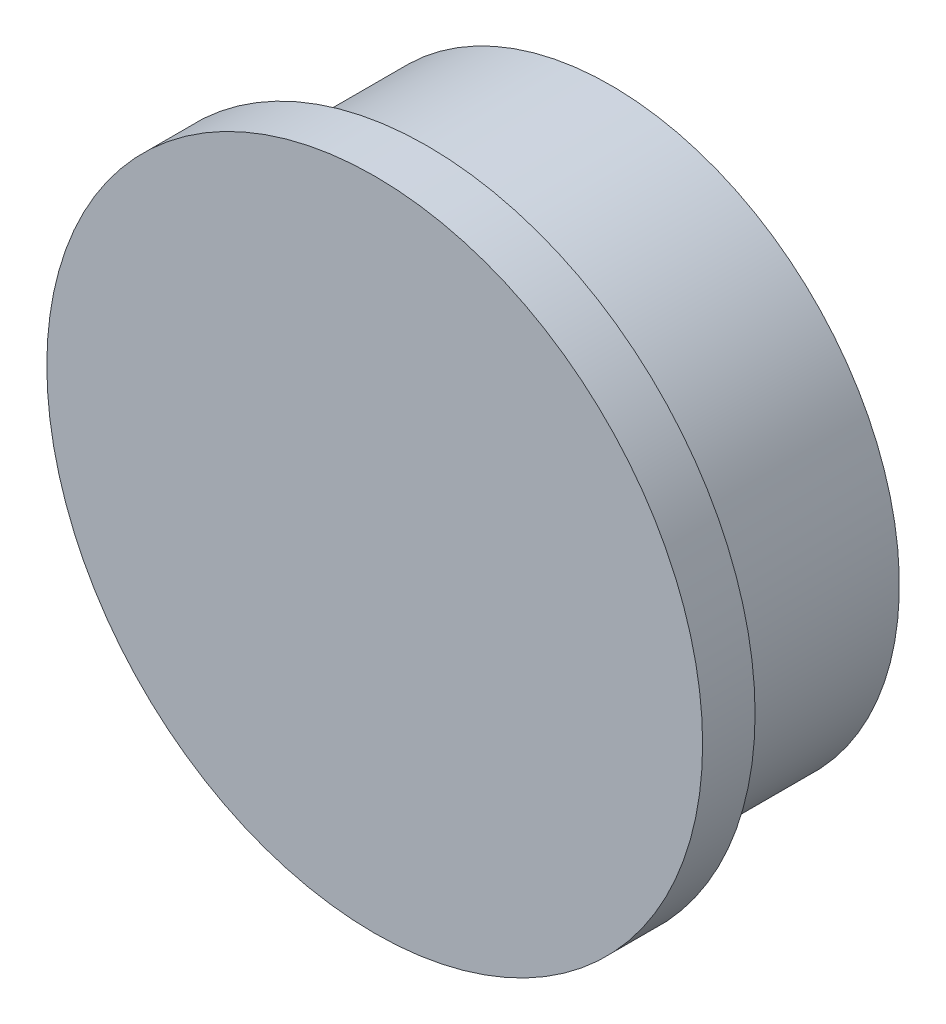
ISO-10303-21;
HEADER;
FILE_DESCRIPTION(('STEP AP214'),'2;1');
FILE_NAME('part.step','',(''),(''),'','','');
FILE_SCHEMA(('AUTOMOTIVE_DESIGN { 1 0 10303 214 1 1 1 1 }'));
ENDSEC;
DATA;
#1=APPLICATION_CONTEXT('core data for automotive mechanical design processes');
#2=APPLICATION_PROTOCOL_DEFINITION('international standard','automotive_design',2000,#1);
#3=PRODUCT_CONTEXT('',#1,'mechanical');
#4=PRODUCT('Part','Part','',(#3));
#5=PRODUCT_RELATED_PRODUCT_CATEGORY('part','',(#4));
#6=PRODUCT_DEFINITION_FORMATION('','',#4);
#7=PRODUCT_DEFINITION_CONTEXT('part definition',#1,'design');
#8=PRODUCT_DEFINITION('design','',#6,#7);
#9=PRODUCT_DEFINITION_SHAPE('','',#8);
#10=(LENGTH_UNIT() NAMED_UNIT(*) SI_UNIT(.MILLI.,.METRE.));
#11=(NAMED_UNIT(*) PLANE_ANGLE_UNIT() SI_UNIT($,.RADIAN.));
#12=(NAMED_UNIT(*) SI_UNIT($,.STERADIAN.) SOLID_ANGLE_UNIT());
#13=UNCERTAINTY_MEASURE_WITH_UNIT(LENGTH_MEASURE(1.E-05),#10,'distance_accuracy_value','');
#14=(GEOMETRIC_REPRESENTATION_CONTEXT(3) GLOBAL_UNCERTAINTY_ASSIGNED_CONTEXT((#13)) GLOBAL_UNIT_ASSIGNED_CONTEXT((#10,
#11,#12)) REPRESENTATION_CONTEXT('',''));
#15=CARTESIAN_POINT('',(0.,0.,0.));
#16=DIRECTION('',(0.,0.,1.));
#17=DIRECTION('',(1.,0.,0.));
#18=AXIS2_PLACEMENT_3D('',#15,#16,#17);
#19=CARTESIAN_POINT('',(0.,0.,2.));
#20=DIRECTION('',(0.,0.,-1.));
#21=DIRECTION('',(-1.,0.,0.));
#22=AXIS2_PLACEMENT_3D('',#19,#20,#21);
#23=CYLINDRICAL_SURFACE('',#22,12.5);
#24=CARTESIAN_POINT('',(0.,0.,2.));
#25=DIRECTION('',(0.,0.,1.));
#26=DIRECTION('',(1.,0.,0.));
#27=AXIS2_PLACEMENT_3D('',#24,#25,#26);
#28=CIRCLE('',#27,12.5);
#29=CARTESIAN_POINT('',(12.5,0.,2.));
#30=VERTEX_POINT('',#29);
#31=EDGE_CURVE('E48',#30,#30,#28,.T.);
#32=ORIENTED_EDGE('',*,*,#31,.F.);
#33=EDGE_LOOP('',(#32));
#34=FACE_BOUND('',#33,.T.);
#35=CARTESIAN_POINT('',(0.,0.,0.));
#36=DIRECTION('',(0.,0.,1.));
#37=DIRECTION('',(1.,0.,0.));
#38=AXIS2_PLACEMENT_3D('',#35,#36,#37);
#39=CIRCLE('',#38,12.5);
#40=CARTESIAN_POINT('',(12.5,0.,0.));
#41=VERTEX_POINT('',#40);
#42=EDGE_CURVE('E44',#41,#41,#39,.T.);
#43=ORIENTED_EDGE('',*,*,#42,.T.);
#44=EDGE_LOOP('',(#43));
#45=FACE_BOUND('',#44,.T.);
#46=ADVANCED_FACE('F41',(#34,#45),#23,.T.);
#47=CARTESIAN_POINT('',(0.,0.,2.));
#48=DIRECTION('',(0.,0.,1.));
#49=DIRECTION('',(1.,0.,0.));
#50=AXIS2_PLACEMENT_3D('',#47,#48,#49);
#51=PLANE('',#50);
#52=ORIENTED_EDGE('',*,*,#31,.T.);
#53=EDGE_LOOP('',(#52));
#54=FACE_BOUND('',#53,.T.);
#55=ADVANCED_FACE('F65',(#54),#51,.T.);
#56=CARTESIAN_POINT('',(0.,0.,0.));
#57=DIRECTION('',(0.,0.,1.));
#58=DIRECTION('',(1.,0.,0.));
#59=AXIS2_PLACEMENT_3D('',#56,#57,#58);
#60=PLANE('',#59);
#61=CARTESIAN_POINT('',(0.,0.,0.));
#62=DIRECTION('',(0.,0.,-1.));
#63=DIRECTION('',(-1.,0.,0.));
#64=AXIS2_PLACEMENT_3D('',#61,#62,#63);
#65=CIRCLE('',#64,11.);
#66=CARTESIAN_POINT('',(-11.,0.,0.));
#67=VERTEX_POINT('',#66);
#68=EDGE_CURVE('E10',#67,#67,#65,.T.);
#69=ORIENTED_EDGE('',*,*,#68,.F.);
#70=EDGE_LOOP('',(#69));
#71=FACE_BOUND('',#70,.T.);
#72=ORIENTED_EDGE('',*,*,#42,.F.);
#73=EDGE_LOOP('',(#72));
#74=FACE_BOUND('',#73,.T.);
#75=ADVANCED_FACE('F62',(#71,#74),#60,.F.);
#76=CARTESIAN_POINT('',(0.,0.,-7.));
#77=DIRECTION('',(0.,0.,1.));
#78=DIRECTION('',(1.,0.,0.));
#79=AXIS2_PLACEMENT_3D('',#76,#77,#78);
#80=CYLINDRICAL_SURFACE('',#79,11.);
#81=CARTESIAN_POINT('',(0.,0.,-7.));
#82=DIRECTION('',(0.,0.,-1.));
#83=DIRECTION('',(-1.,0.,0.));
#84=AXIS2_PLACEMENT_3D('',#81,#82,#83);
#85=CIRCLE('',#84,11.);
#86=CARTESIAN_POINT('',(-11.,0.,-7.));
#87=VERTEX_POINT('',#86);
#88=EDGE_CURVE('E54',#87,#87,#85,.T.);
#89=ORIENTED_EDGE('',*,*,#88,.F.);
#90=EDGE_LOOP('',(#89));
#91=FACE_BOUND('',#90,.T.);
#92=ORIENTED_EDGE('',*,*,#68,.T.);
#93=EDGE_LOOP('',(#92));
#94=FACE_BOUND('',#93,.T.);
#95=ADVANCED_FACE('F64',(#91,#94),#80,.T.);
#96=CARTESIAN_POINT('',(0.,0.,-7.));
#97=DIRECTION('',(0.,0.,-1.));
#98=DIRECTION('',(-1.,0.,0.));
#99=AXIS2_PLACEMENT_3D('',#96,#97,#98);
#100=PLANE('',#99);
#101=ORIENTED_EDGE('',*,*,#88,.T.);
#102=EDGE_LOOP('',(#101));
#103=FACE_BOUND('',#102,.T.);
#104=ADVANCED_FACE('F71',(#103),#100,.T.);
#105=CLOSED_SHELL('',(#46,#55,#75,#95,#104));
#106=MANIFOLD_SOLID_BREP('B2',#105);
#107=ADVANCED_BREP_SHAPE_REPRESENTATION('',(#18,#106),#14);
#108=SHAPE_DEFINITION_REPRESENTATION(#9,#107);
ENDSEC;
END-ISO-10303-21;
